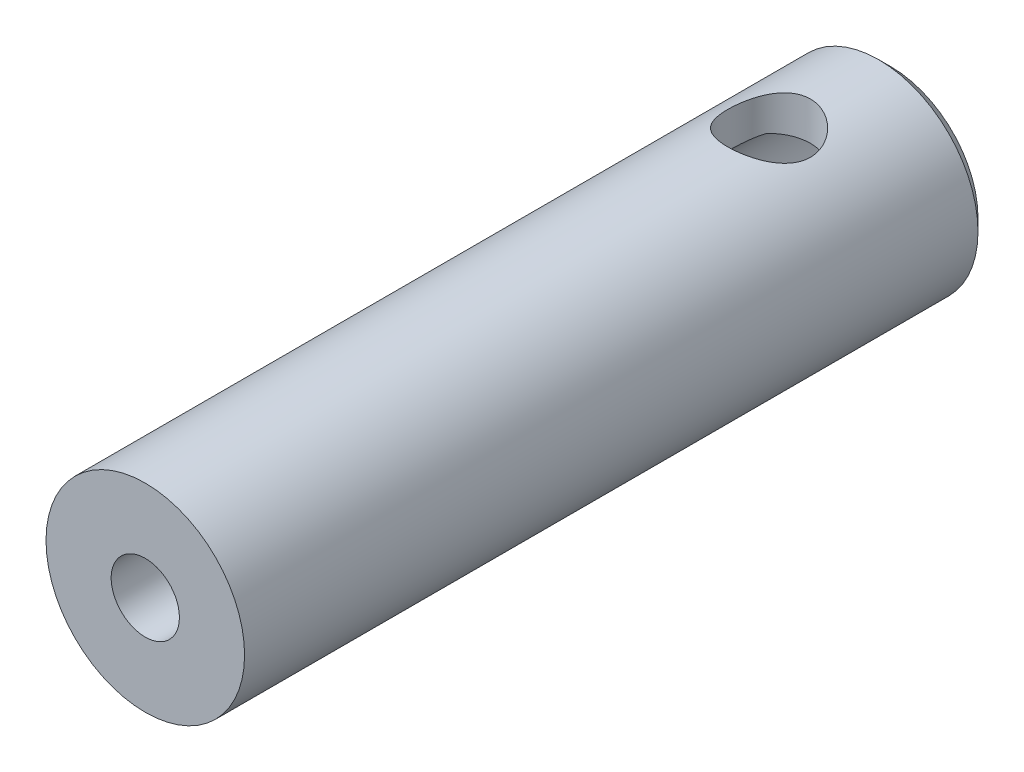
ISO-10303-21;
HEADER;
FILE_DESCRIPTION(('STEP AP214'),'2;1');
FILE_NAME('part.step','',(''),(''),'','','');
FILE_SCHEMA(('AUTOMOTIVE_DESIGN { 1 0 10303 214 1 1 1 1 }'));
ENDSEC;
DATA;
#1=APPLICATION_CONTEXT('core data for automotive mechanical design processes');
#2=APPLICATION_PROTOCOL_DEFINITION('international standard','automotive_design',2000,#1);
#3=PRODUCT_CONTEXT('',#1,'mechanical');
#4=PRODUCT('Part','Part','',(#3));
#5=PRODUCT_RELATED_PRODUCT_CATEGORY('part','',(#4));
#6=PRODUCT_DEFINITION_FORMATION('','',#4);
#7=PRODUCT_DEFINITION_CONTEXT('part definition',#1,'design');
#8=PRODUCT_DEFINITION('design','',#6,#7);
#9=PRODUCT_DEFINITION_SHAPE('','',#8);
#10=(LENGTH_UNIT() NAMED_UNIT(*) SI_UNIT(.MILLI.,.METRE.));
#11=(NAMED_UNIT(*) PLANE_ANGLE_UNIT() SI_UNIT($,.RADIAN.));
#12=(NAMED_UNIT(*) SI_UNIT($,.STERADIAN.) SOLID_ANGLE_UNIT());
#13=UNCERTAINTY_MEASURE_WITH_UNIT(LENGTH_MEASURE(1.E-05),#10,'distance_accuracy_value','');
#14=(GEOMETRIC_REPRESENTATION_CONTEXT(3) GLOBAL_UNCERTAINTY_ASSIGNED_CONTEXT((#13)) GLOBAL_UNIT_ASSIGNED_CONTEXT((#10,
#11,#12)) REPRESENTATION_CONTEXT('',''));
#15=CARTESIAN_POINT('',(0.,0.,0.));
#16=DIRECTION('',(0.,0.,1.));
#17=DIRECTION('',(1.,0.,0.));
#18=AXIS2_PLACEMENT_3D('',#15,#16,#17);
#19=CARTESIAN_POINT('',(1.26095202129185,2.5,14.));
#20=DIRECTION('',(0.,1.,0.));
#21=DIRECTION('',(0.,0.,1.));
#22=AXIS2_PLACEMENT_3D('',#19,#20,#21);
#23=PLANE('',#22);
#24=DIRECTION('',(0.,0.,-1.));
#25=VECTOR('',#24,1.);
#26=CARTESIAN_POINT('',(1.26095202129185,2.5,14.));
#27=LINE('',#26,#25);
#28=CARTESIAN_POINT('',(1.26095202129185,2.5,3.85982457490088));
#29=VERTEX_POINT('',#28);
#30=CARTESIAN_POINT('',(1.26095202129185,2.5,3.));
#31=VERTEX_POINT('',#30);
#32=EDGE_CURVE('E59',#29,#31,#27,.T.);
#33=ORIENTED_EDGE('',*,*,#32,.F.);
#34=CARTESIAN_POINT('',(0.,2.5,5.));
#35=DIRECTION('',(0.,1.,0.));
#36=DIRECTION('',(0.,0.,1.));
#37=AXIS2_PLACEMENT_3D('',#34,#35,#36);
#38=CIRCLE('',#37,1.69999999999999);
#39=CARTESIAN_POINT('',(-1.26095202129185,2.5,3.85982457490088));
#40=VERTEX_POINT('',#39);
#41=EDGE_CURVE('E79',#29,#40,#38,.T.);
#42=ORIENTED_EDGE('',*,*,#41,.T.);
#43=DIRECTION('',(0.,0.,-1.));
#44=VECTOR('',#43,1.);
#45=CARTESIAN_POINT('',(-1.26095202129185,2.5,14.));
#46=LINE('',#45,#44);
#47=CARTESIAN_POINT('',(-1.26095202129185,2.5,3.));
#48=VERTEX_POINT('',#47);
#49=EDGE_CURVE('E85',#40,#48,#46,.T.);
#50=ORIENTED_EDGE('',*,*,#49,.T.);
#51=DIRECTION('',(-1.,0.,0.));
#52=VECTOR('',#51,1.);
#53=CARTESIAN_POINT('',(1.26095202129185,2.5,3.));
#54=LINE('',#53,#52);
#55=EDGE_CURVE('E105',#31,#48,#54,.T.);
#56=ORIENTED_EDGE('',*,*,#55,.F.);
#57=EDGE_LOOP('',(#33,#42,#50,#56));
#58=FACE_BOUND('',#57,.T.);
#59=ADVANCED_FACE('F32',(#58),#23,.F.);
#60=CARTESIAN_POINT('',(-1.26095202129185,2.5,14.));
#61=VERTEX_POINT('',#60);
#62=CARTESIAN_POINT('',(-1.26095202129185,2.5,6.14017542509912));
#63=VERTEX_POINT('',#62);
#64=EDGE_CURVE('E92',#61,#63,#46,.T.);
#65=ORIENTED_EDGE('',*,*,#64,.T.);
#66=CARTESIAN_POINT('',(1.26095202129185,2.5,6.14017542509912));
#67=VERTEX_POINT('',#66);
#68=EDGE_CURVE('E52',#63,#67,#38,.T.);
#69=ORIENTED_EDGE('',*,*,#68,.T.);
#70=CARTESIAN_POINT('',(1.26095202129185,2.5,14.));
#71=VERTEX_POINT('',#70);
#72=EDGE_CURVE('E100',#71,#67,#27,.T.);
#73=ORIENTED_EDGE('',*,*,#72,.F.);
#74=DIRECTION('',(1.,0.,0.));
#75=VECTOR('',#74,1.);
#76=CARTESIAN_POINT('',(1.26095202129185,2.5,14.));
#77=LINE('',#76,#75);
#78=EDGE_CURVE('E93',#61,#71,#77,.T.);
#79=ORIENTED_EDGE('',*,*,#78,.F.);
#80=EDGE_LOOP('',(#65,#69,#73,#79));
#81=FACE_BOUND('',#80,.T.);
#82=ADVANCED_FACE('F125',(#81),#23,.F.);
#83=CARTESIAN_POINT('',(0.,0.,30.6));
#84=DIRECTION('',(0.,0.,-1.));
#85=DIRECTION('',(-1.,0.,0.));
#86=AXIS2_PLACEMENT_3D('',#83,#84,#85);
#87=CYLINDRICAL_SURFACE('',#86,4.075);
#88=CARTESIAN_POINT('',(0.,4.075,6.69999999999999));
#89=CARTESIAN_POINT('',(-0.0910534279162395,4.07499260432126,6.69999016654546));
#90=CARTESIAN_POINT('',(-0.182249549872274,4.07191284590084,6.69264128888376));
#91=CARTESIAN_POINT('',(-0.362056668819456,4.05989082699971,6.66350693807894));
#92=CARTESIAN_POINT('',(-0.450660299103877,4.05093328962757,6.64168384350974));
#93=CARTESIAN_POINT('',(-0.622386422636992,4.02811806766699,6.58454783682235));
#94=CARTESIAN_POINT('',(-0.70552639330874,4.0142770107511,6.54928066744866));
#95=CARTESIAN_POINT('',(-0.864629267297827,3.98304198973891,6.4664466407294));
#96=CARTESIAN_POINT('',(-0.940594325358632,3.96564909731044,6.41888349220596));
#97=CARTESIAN_POINT('',(-1.08713350591362,3.92807192381843,6.31028059042402));
#98=CARTESIAN_POINT('',(-1.15729932171407,3.90779608252746,6.24872186467343));
#99=CARTESIAN_POINT('',(-1.28666231760976,3.86713488276138,6.11497259773166));
#100=CARTESIAN_POINT('',(-1.34585370934304,3.84674947229451,6.04277648176715));
#101=CARTESIAN_POINT('',(-1.45447425332522,3.80705165053085,5.88548284308962));
#102=CARTESIAN_POINT('',(-1.50327745916567,3.78784184354422,5.79992445517416));
#103=CARTESIAN_POINT('',(-1.58561728606681,3.75412270424878,5.62089547195574));
#104=CARTESIAN_POINT('',(-1.61916179090438,3.73961094569958,5.52742899223453));
#105=CARTESIAN_POINT('',(-1.6683448945238,3.71792220755995,5.33993658474451));
#106=CARTESIAN_POINT('',(-1.68476941918664,3.71042508504694,5.24615528508344));
#107=CARTESIAN_POINT('',(-1.70169818392718,3.70269417493778,5.05689122174614));
#108=CARTESIAN_POINT('',(-1.70221123488145,3.70245636754358,4.96140942901891));
#109=CARTESIAN_POINT('',(-1.68789435208567,3.70900008143274,4.77929199480359));
#110=CARTESIAN_POINT('',(-1.67424100385821,3.71524333975978,4.6925406284622));
#111=CARTESIAN_POINT('',(-1.63395282295761,3.73313592174508,4.52269596424905));
#112=CARTESIAN_POINT('',(-1.60731549701446,3.74478628369088,4.43960337230232));
#113=CARTESIAN_POINT('',(-1.54129596328105,3.77244366379775,4.27733409752812));
#114=CARTESIAN_POINT('',(-1.50165432564395,3.78853820935987,4.19827855328006));
#115=CARTESIAN_POINT('',(-1.41093492637839,3.82325026942016,4.04763369118805));
#116=CARTESIAN_POINT('',(-1.35985264853085,3.8418687791102,3.97604733822809));
#117=CARTESIAN_POINT('',(-1.24262055652557,3.88145027955752,3.83598833236373));
#118=CARTESIAN_POINT('',(-1.17556074225042,3.90247824557875,3.76829356788834));
#119=CARTESIAN_POINT('',(-1.03083250697166,3.94317844002384,3.64484949164498));
#120=CARTESIAN_POINT('',(-0.953161595807413,3.96285034857946,3.58910299174967));
#121=CARTESIAN_POINT('',(-0.787047104901489,3.99919568056005,3.48999333024618));
#122=CARTESIAN_POINT('',(-0.698395478119116,4.01578899089647,3.44694731408156));
#123=CARTESIAN_POINT('',(-0.514240002465009,4.04349231807901,3.37665296205483));
#124=CARTESIAN_POINT('',(-0.418739983134088,4.05460537245267,3.34939587343744));
#125=CARTESIAN_POINT('',(-0.230098689883129,4.06952818961072,3.31308295550875));
#126=CARTESIAN_POINT('',(-0.137191403769883,4.07375610842914,3.30298323585278));
#127=CARTESIAN_POINT('',(0.0490790617836757,4.07576757215171,3.29815868845004));
#128=CARTESIAN_POINT('',(0.142442102194162,4.07355297301933,3.3034294327742));
#129=CARTESIAN_POINT('',(0.322080543031627,4.06319935163477,3.32844952224077));
#130=CARTESIAN_POINT('',(0.408477418688553,4.05536070541397,3.34746513383237));
#131=CARTESIAN_POINT('',(0.576759971311243,4.03486841911517,3.39841328174211));
#132=CARTESIAN_POINT('',(0.658645077207279,4.02221417110583,3.43034744895702));
#133=CARTESIAN_POINT('',(0.818452005377538,3.99281488074206,3.50726920959317));
#134=CARTESIAN_POINT('',(0.896171604715423,3.97595493985345,3.55263158992438));
#135=CARTESIAN_POINT('',(1.04317388541862,3.93994292948317,3.65471034369173));
#136=CARTESIAN_POINT('',(1.11245302097279,3.92078990333713,3.71143146262459));
#137=CARTESIAN_POINT('',(1.24582425620624,3.88055944974031,3.83937094187287));
#138=CARTESIAN_POINT('',(1.30918929155551,3.85944245187667,3.91133673509275));
#139=CARTESIAN_POINT('',(1.42314684852216,3.8188932549299,4.06521590502212));
#140=CARTESIAN_POINT('',(1.47373644300583,3.79946144262817,4.1471315551063));
#141=CARTESIAN_POINT('',(1.56126065330767,3.76435329429814,4.32029076047103));
#142=CARTESIAN_POINT('',(1.59798822780163,3.74873504348648,4.41165161437387));
#143=CARTESIAN_POINT('',(1.65522549985618,3.72382144081087,4.60011740509648));
#144=CARTESIAN_POINT('',(1.67574861444973,3.71452085891164,4.69721751814073));
#145=CARTESIAN_POINT('',(1.69865947409782,3.70409568472623,4.88633590120618));
#146=CARTESIAN_POINT('',(1.70232387216982,3.70239582374902,4.97816850494121));
#147=CARTESIAN_POINT('',(1.69482319478967,3.70583553098445,5.1610859621772));
#148=CARTESIAN_POINT('',(1.68366040936731,3.71097404302386,5.25217092896323));
#149=CARTESIAN_POINT('',(1.64789549873334,3.72698517648098,5.42661662756391));
#150=CARTESIAN_POINT('',(1.62394651128868,3.73757830393934,5.51013937068203));
#151=CARTESIAN_POINT('',(1.56392843306002,3.76308522257692,5.67199993664729));
#152=CARTESIAN_POINT('',(1.52785593489783,3.77800022828078,5.75033629441555));
#153=CARTESIAN_POINT('',(1.44211375643517,3.81158384925509,5.90474884747401));
#154=CARTESIAN_POINT('',(1.3917561527253,3.83042440065822,5.98040495898851));
#155=CARTESIAN_POINT('',(1.27983533233093,3.86925734177807,6.12259264936897));
#156=CARTESIAN_POINT('',(1.21826821487897,3.88925013079831,6.18912103772756));
#157=CARTESIAN_POINT('',(1.08033387195235,3.92989004049958,6.31616769472346));
#158=CARTESIAN_POINT('',(1.00321382092644,3.95047818719304,6.37589131633013));
#159=CARTESIAN_POINT('',(0.839283350923429,3.98852075247719,6.481590821251));
#160=CARTESIAN_POINT('',(0.752468542464769,4.00597374216198,6.52756044224544));
#161=CARTESIAN_POINT('',(0.572952091897065,4.03552874885844,6.60345578139557));
#162=CARTESIAN_POINT('',(0.480370816468083,4.04771408619487,6.63363304202708));
#163=CARTESIAN_POINT('',(0.290998633115147,4.06570008796472,6.67770950583355));
#164=CARTESIAN_POINT('',(0.194221894391157,4.07152073033666,6.69165965262609));
#165=CARTESIAN_POINT('',(0.0647377695559406,4.07461677186881,6.69907900098689));
#166=CARTESIAN_POINT('',(0.0323779063196759,4.0750026298471,6.70000349670161));
#167=CARTESIAN_POINT('',(0.,4.075,6.69999999999999));
#168=B_SPLINE_CURVE_WITH_KNOTS('',3,(#88,#89,#90,#91,#92,#93,#94,#95,#96,#97,#98,#99,#100,#101,
#102,#103,#104,#105,#106,#107,#108,#109,#110,#111,#112,#113,#114,#115,#116,#117,#118,#119,#120,
#121,#122,#123,#124,#125,#126,#127,#128,#129,#130,#131,#132,#133,#134,#135,#136,#137,#138,#139,
#140,#141,#142,#143,#144,#145,#146,#147,#148,#149,#150,#151,#152,#153,#154,#155,#156,#157,#158,
#159,#160,#161,#162,#163,#164,#165,#166,#167),.UNSPECIFIED.,.T.,.F.,(4,2,2,2,2,2,2,2,2,2,2,2,2,
2,2,2,2,2,2,2,2,2,2,2,2,2,2,2,2,2,2,2,2,2,2,2,2,2,2,4),(0.,0.273067961935496,0.546848479019654,
0.819705668815404,1.09248065284021,1.37779406507045,1.66325753785151,1.96280906918323,
2.26220565368413,2.5471551361555,2.83194682685858,3.09484281323472,3.35778930255172,
3.62633766076553,3.89499221649893,4.18641223089118,4.47790075217045,4.77614882786838,
5.07423140803913,5.35342582142094,5.63253981231679,5.89776085484546,6.16301539052991,
6.43651244967183,6.71012401072802,7.00333537491354,7.29661385942443,7.59411398935441,
7.89136753487988,8.16569461478568,8.43997933033143,8.701432681828,8.9629595777377,
9.24023325348693,9.51760360198916,9.81524629487308,10.1130243016325,10.4059026353956,
10.6978590000612,10.7949598900858),.UNSPECIFIED.);
#169=CARTESIAN_POINT('',(0.,4.075,6.69999999999999));
#170=VERTEX_POINT('',#169);
#171=EDGE_CURVE('E87',#170,#170,#168,.T.);
#172=ORIENTED_EDGE('',*,*,#171,.T.);
#173=EDGE_LOOP('',(#172));
#174=FACE_BOUND('',#173,.T.);
#175=CARTESIAN_POINT('',(0.,0.,0.5));
#176=DIRECTION('',(0.,0.,1.));
#177=DIRECTION('',(1.,0.,0.));
#178=AXIS2_PLACEMENT_3D('',#175,#176,#177);
#179=CIRCLE('',#178,4.075);
#180=CARTESIAN_POINT('',(4.075,0.,0.5));
#181=VERTEX_POINT('',#180);
#182=EDGE_CURVE('E107',#181,#181,#179,.T.);
#183=ORIENTED_EDGE('',*,*,#182,.T.);
#184=EDGE_LOOP('',(#183));
#185=FACE_BOUND('',#184,.T.);
#186=CARTESIAN_POINT('',(0.,0.,30.6));
#187=DIRECTION('',(0.,0.,1.));
#188=DIRECTION('',(1.,0.,0.));
#189=AXIS2_PLACEMENT_3D('',#186,#187,#188);
#190=CIRCLE('',#189,4.075);
#191=CARTESIAN_POINT('',(4.075,0.,30.6));
#192=VERTEX_POINT('',#191);
#193=EDGE_CURVE('E102',#192,#192,#190,.T.);
#194=ORIENTED_EDGE('',*,*,#193,.F.);
#195=EDGE_LOOP('',(#194));
#196=FACE_BOUND('',#195,.T.);
#197=ADVANCED_FACE('F121',(#174,#185,#196),#87,.T.);
#198=CARTESIAN_POINT('',(0.,0.,30.6));
#199=DIRECTION('',(0.,0.,1.));
#200=DIRECTION('',(1.,0.,0.));
#201=AXIS2_PLACEMENT_3D('',#198,#199,#200);
#202=PLANE('',#201);
#203=CARTESIAN_POINT('',(0.,0.,30.6));
#204=DIRECTION('',(0.,0.,1.));
#205=DIRECTION('',(1.,0.,0.));
#206=AXIS2_PLACEMENT_3D('',#203,#204,#205);
#207=CIRCLE('',#206,1.4);
#208=CARTESIAN_POINT('',(1.4,0.,30.6));
#209=VERTEX_POINT('',#208);
#210=EDGE_CURVE('E161',#209,#209,#207,.T.);
#211=ORIENTED_EDGE('',*,*,#210,.F.);
#212=EDGE_LOOP('',(#211));
#213=FACE_BOUND('',#212,.T.);
#214=ORIENTED_EDGE('',*,*,#193,.T.);
#215=EDGE_LOOP('',(#214));
#216=FACE_BOUND('',#215,.T.);
#217=ADVANCED_FACE('F124',(#213,#216),#202,.T.);
#218=CARTESIAN_POINT('',(0.,0.,0.));
#219=DIRECTION('',(0.,0.,1.));
#220=DIRECTION('',(1.,0.,0.));
#221=AXIS2_PLACEMENT_3D('',#218,#219,#220);
#222=PLANE('',#221);
#223=CARTESIAN_POINT('',(0.,0.,0.));
#224=DIRECTION('',(0.,0.,1.));
#225=DIRECTION('',(1.,0.,0.));
#226=AXIS2_PLACEMENT_3D('',#223,#224,#225);
#227=CIRCLE('',#226,3.575);
#228=CARTESIAN_POINT('',(3.575,0.,0.));
#229=VERTEX_POINT('',#228);
#230=EDGE_CURVE('E82',#229,#229,#227,.F.);
#231=ORIENTED_EDGE('',*,*,#230,.T.);
#232=EDGE_LOOP('',(#231));
#233=FACE_BOUND('',#232,.T.);
#234=CARTESIAN_POINT('',(0.,0.,0.));
#235=DIRECTION('',(0.,0.,-1.));
#236=DIRECTION('',(-1.,0.,0.));
#237=AXIS2_PLACEMENT_3D('',#234,#235,#236);
#238=CIRCLE('',#237,2.8);
#239=CARTESIAN_POINT('',(-2.8,0.,0.));
#240=VERTEX_POINT('',#239);
#241=EDGE_CURVE('E155',#240,#240,#238,.T.);
#242=ORIENTED_EDGE('',*,*,#241,.F.);
#243=EDGE_LOOP('',(#242));
#244=FACE_BOUND('',#243,.T.);
#245=ADVANCED_FACE('F112',(#233,#244),#222,.F.);
#246=CARTESIAN_POINT('',(0.,0.,14.));
#247=DIRECTION('',(0.,0.,-1.));
#248=DIRECTION('',(-1.,0.,0.));
#249=AXIS2_PLACEMENT_3D('',#246,#247,#248);
#250=CYLINDRICAL_SURFACE('',#249,2.8);
#251=ORIENTED_EDGE('',*,*,#241,.T.);
#252=EDGE_LOOP('',(#251));
#253=FACE_BOUND('',#252,.T.);
#254=ORIENTED_EDGE('',*,*,#72,.T.);
#255=CARTESIAN_POINT('',(0.,2.8,6.69999999999999));
#256=CARTESIAN_POINT('',(0.0867923790096469,2.79999451557529,6.69999397505488));
#257=CARTESIAN_POINT('',(0.173716595999157,2.79592066232847,6.69330668431786));
#258=CARTESIAN_POINT('',(0.344934496289961,2.78000986148793,6.66690181855674));
#259=CARTESIAN_POINT('',(0.429221625402907,2.76815496759414,6.64715412002183));
#260=CARTESIAN_POINT('',(0.592330632544928,2.7378809150248,6.59575062154612));
#261=CARTESIAN_POINT('',(0.671177351817991,2.71949432868323,6.5641538678972));
#262=CARTESIAN_POINT('',(0.822194909010507,2.67771229019546,6.49032469431543));
#263=CARTESIAN_POINT('',(0.894367132324886,2.65431788085708,6.44809448832537));
#264=CARTESIAN_POINT('',(1.03631433953641,2.60234461475156,6.3505678060868));
#265=CARTESIAN_POINT('',(1.10547052376289,2.57350453002685,6.29451256515499));
#266=CARTESIAN_POINT('',(1.23400325224467,2.51440884234026,6.17264419488545));
#267=CARTESIAN_POINT('',(1.29336687078338,2.48415143511916,6.10681838305033));
#268=CARTESIAN_POINT('',(1.40823759213748,2.42108983100889,5.95751193501877));
#269=CARTESIAN_POINT('',(1.46231205257491,2.38844625687043,5.87285160332377));
#270=CARTESIAN_POINT('',(1.55527495920521,2.32898615859552,5.69372707266815));
#271=CARTESIAN_POINT('',(1.59418837588441,2.30216008553566,5.59927932141534));
#272=CARTESIAN_POINT('',(1.64732648291046,2.26431144925895,5.42698755201206));
#273=CARTESIAN_POINT('',(1.66527284415021,2.25102316174489,5.3507915682136));
#274=CARTESIAN_POINT('',(1.69051038317085,2.2321363163772,5.19576032669432));
#275=CARTESIAN_POINT('',(1.69781530507956,2.22652784009896,5.11692860813524));
#276=CARTESIAN_POINT('',(1.70134350968917,2.22383387104738,4.95869797437812));
#277=CARTESIAN_POINT('',(1.69754311643873,2.22676658760613,4.87929820789355));
#278=CARTESIAN_POINT('',(1.67905646234004,2.24073554137711,4.72248665133116));
#279=CARTESIAN_POINT('',(1.66436184957479,2.25177799575728,4.64507643365115));
#280=CARTESIAN_POINT('',(1.62519639660849,2.28019806291905,4.49538429956974));
#281=CARTESIAN_POINT('',(1.60088117749191,2.29747446285908,4.42304134342562));
#282=CARTESIAN_POINT('',(1.54338373916694,2.33648692467598,4.28328244542408));
#283=CARTESIAN_POINT('',(1.51019830501119,2.35822460284734,4.21586830128483));
#284=CARTESIAN_POINT('',(1.42908695886539,2.40839487254795,4.07510292592938));
#285=CARTESIAN_POINT('',(1.37958766776812,2.43733005368179,4.00283718021966));
#286=CARTESIAN_POINT('',(1.27029399301876,2.49603869456807,3.86687476405557));
#287=CARTESIAN_POINT('',(1.21048953295054,2.52581295070822,3.80318659039453));
#288=CARTESIAN_POINT('',(1.07189642441943,2.58797423181749,3.6767189138424));
#289=CARTESIAN_POINT('',(0.99161033925725,2.62010587161609,3.61543664660648));
#290=CARTESIAN_POINT('',(0.819952493151537,2.6787845899605,3.50737025550734));
#291=CARTESIAN_POINT('',(0.72858631055062,2.70533446042827,3.46057887793919));
#292=CARTESIAN_POINT('',(0.542868662296561,2.74842010228645,3.38609864844368));
#293=CARTESIAN_POINT('',(0.449037696876518,2.76546718541763,3.3574201481484));
#294=CARTESIAN_POINT('',(0.256662941472118,2.78988939278999,3.31662334496725));
#295=CARTESIAN_POINT('',(0.158125244512409,2.79727668811314,3.30448420210912));
#296=CARTESIAN_POINT('',(-0.0259215301712412,2.80117884910645,3.29805981187145));
#297=CARTESIAN_POINT('',(-0.111331838953446,2.79906586336498,3.30152148495674));
#298=CARTESIAN_POINT('',(-0.280142230484364,2.78723416918719,3.32109075919178));
#299=CARTESIAN_POINT('',(-0.363542377930744,2.77751570587337,3.33719795277983));
#300=CARTESIAN_POINT('',(-0.523704965604631,2.75175159267244,3.38060807223233));
#301=CARTESIAN_POINT('',(-0.600588450958491,2.73589275817166,3.40758130704503));
#302=CARTESIAN_POINT('',(-0.748704623929292,2.69912409561423,3.47161619996232));
#303=CARTESIAN_POINT('',(-0.819936246924112,2.67821331892677,3.50867975294713));
#304=CARTESIAN_POINT('',(-0.962685341140004,2.6304884736397,3.59609516543401));
#305=CARTESIAN_POINT('',(-1.03347354662207,2.60328787564021,3.64742369381889));
#306=CARTESIAN_POINT('',(-1.16595888118392,2.54671183526516,3.75979844836106));
#307=CARTESIAN_POINT('',(-1.22764534771534,2.51733390173237,3.82085590042952));
#308=CARTESIAN_POINT('',(-1.34875100030788,2.45481392232603,3.96051407279169));
#309=CARTESIAN_POINT('',(-1.40674455202725,2.42169810330617,4.04037009642046));
#310=CARTESIAN_POINT('',(-1.50858447105766,2.35960471858085,4.21009947339707));
#311=CARTESIAN_POINT('',(-1.55244443128873,2.33062319178198,4.29996308935951));
#312=CARTESIAN_POINT('',(-1.61648681595649,2.28651426673801,4.46782548575914));
#313=CARTESIAN_POINT('',(-1.63973279257598,2.26974781281423,4.54421954338138));
#314=CARTESIAN_POINT('',(-1.67535761647067,2.24358527382213,4.70068070792989));
#315=CARTESIAN_POINT('',(-1.68775214407594,2.23417855604331,4.78074233846084));
#316=CARTESIAN_POINT('',(-1.7009844142736,2.22412432782844,4.94273530378859));
#317=CARTESIAN_POINT('',(-1.70177272816791,2.22351428099896,5.02467314773345));
#318=CARTESIAN_POINT('',(-1.69160657251815,2.23125584958215,5.18740449615351));
#319=CARTESIAN_POINT('',(-1.68064624006059,2.23961193935775,5.26819740888035));
#320=CARTESIAN_POINT('',(-1.64862335984465,2.26327233999024,5.42171825605707));
#321=CARTESIAN_POINT('',(-1.62817128145921,2.27815412635314,5.49464349509154));
#322=CARTESIAN_POINT('',(-1.57830836120597,2.31297735818379,5.63605907686564));
#323=CARTESIAN_POINT('',(-1.54889409625711,2.33292073642483,5.70454771291626));
#324=CARTESIAN_POINT('',(-1.4768206702706,2.37930644792882,5.84631548580965));
#325=CARTESIAN_POINT('',(-1.4328283779198,2.40627579904868,5.91874229883683));
#326=CARTESIAN_POINT('',(-1.33498209938639,2.46190919882908,6.05590328397896));
#327=CARTESIAN_POINT('',(-1.28111994323569,2.49057463804922,6.12063100927988));
#328=CARTESIAN_POINT('',(-1.15411424808371,2.55221798659201,6.25209826520228));
#329=CARTESIAN_POINT('',(-1.07924690061424,2.58508251457043,6.31724311148128));
#330=CARTESIAN_POINT('',(-0.918124598454873,2.64660049402965,6.43421233956346));
#331=CARTESIAN_POINT('',(-0.831864827562106,2.67525215361285,6.4860310602229));
#332=CARTESIAN_POINT('',(-0.651669750252535,2.72466744697905,6.57323880171017));
#333=CARTESIAN_POINT('',(-0.557947581856716,2.74559220582331,6.6089673045267));
#334=CARTESIAN_POINT('',(-0.412874850303176,2.76982932033011,6.649868690515));
#335=CARTESIAN_POINT('',(-0.363821563134749,2.77671328350105,6.66138193804041));
#336=CARTESIAN_POINT('',(-0.264615682189275,2.78791308714247,6.68003492326309));
#337=CARTESIAN_POINT('',(-0.214464008717459,2.79223099824936,6.68717818738887));
#338=CARTESIAN_POINT('',(-0.136805723650344,2.79678920348117,6.6947075400577));
#339=CARTESIAN_POINT('',(-0.109498028697674,2.79799154721475,6.69669044252524));
#340=CARTESIAN_POINT('',(-0.0547979400166195,2.79959782990814,6.69933765435597));
#341=CARTESIAN_POINT('',(-0.0274055424109707,2.80000173176073,6.70000190243533));
#342=CARTESIAN_POINT('',(0.,2.8,6.69999999999999));
#343=B_SPLINE_CURVE_WITH_KNOTS('',3,(#255,#256,#257,#258,#259,#260,#261,#262,#263,#264,#265,
#266,#267,#268,#269,#270,#271,#272,#273,#274,#275,#276,#277,#278,#279,#280,#281,#282,#283,#284,
#285,#286,#287,#288,#289,#290,#291,#292,#293,#294,#295,#296,#297,#298,#299,#300,#301,#302,#303,
#304,#305,#306,#307,#308,#309,#310,#311,#312,#313,#314,#315,#316,#317,#318,#319,#320,#321,#322,
#323,#324,#325,#326,#327,#328,#329,#330,#331,#332,#333,#334,#335,#336,#337,#338,#339,#340,#341,
#342),.UNSPECIFIED.,.T.,.F.,(4,2,2,2,2,2,2,2,2,2,2,2,2,2,2,2,2,2,2,2,2,2,2,2,2,2,2,2,2,2,2,2,2,
2,2,2,2,2,2,2,2,2,2,4),(0.,0.260265769911103,0.521133939783651,0.78071906047626,1.0402501787565,
1.31988596205512,1.5998879477747,1.91523359947858,2.23005765369065,2.46725660076057,
2.70414891713305,2.94154664376079,3.17912655682798,3.41301099822202,3.64698032461146,
3.9226781731662,4.1986471454631,4.51500640492495,4.83120704750064,5.12815473013283,
5.42472790472432,5.67995593590866,5.93517574150048,6.18317384394455,6.43121855059168,
6.70486373162473,6.97882698108228,7.28970739366292,7.60028791978447,7.84407372387212,
8.08750667359221,8.33197606036321,8.57656750123091,8.80723806775184,9.03799684890349,
9.30380386610038,9.5698319123028,9.8819544058643,10.1942092756566,10.4995258768898,
10.6518723907037,10.8040958033167,10.8862734462151,10.9684549081915),.UNSPECIFIED.);
#344=EDGE_CURVE('E11',#67,#29,#343,.T.);
#345=ORIENTED_EDGE('',*,*,#344,.T.);
#346=ORIENTED_EDGE('',*,*,#32,.T.);
#347=CARTESIAN_POINT('',(0.,0.,3.));
#348=DIRECTION('',(0.,0.,-1.));
#349=DIRECTION('',(-1.,0.,0.));
#350=AXIS2_PLACEMENT_3D('',#347,#348,#349);
#351=CIRCLE('',#350,2.8);
#352=EDGE_CURVE('E91',#48,#31,#351,.T.);
#353=ORIENTED_EDGE('',*,*,#352,.F.);
#354=ORIENTED_EDGE('',*,*,#49,.F.);
#355=EDGE_CURVE('E36',#40,#63,#343,.T.);
#356=ORIENTED_EDGE('',*,*,#355,.T.);
#357=ORIENTED_EDGE('',*,*,#64,.F.);
#358=CARTESIAN_POINT('',(0.,0.,14.));
#359=DIRECTION('',(0.,0.,-1.));
#360=DIRECTION('',(-1.,0.,0.));
#361=AXIS2_PLACEMENT_3D('',#358,#359,#360);
#362=CIRCLE('',#361,2.8);
#363=EDGE_CURVE('E96',#71,#61,#362,.T.);
#364=ORIENTED_EDGE('',*,*,#363,.F.);
#365=EDGE_LOOP('',(#254,#345,#346,#353,#354,#356,#357,#364));
#366=FACE_BOUND('',#365,.T.);
#367=ADVANCED_FACE('F90',(#253,#366),#250,.F.);
#368=CARTESIAN_POINT('',(0.,0.,14.));
#369=DIRECTION('',(0.,0.,-1.));
#370=DIRECTION('',(-1.,0.,0.));
#371=AXIS2_PLACEMENT_3D('',#368,#369,#370);
#372=PLANE('',#371);
#373=ORIENTED_EDGE('',*,*,#363,.T.);
#374=ORIENTED_EDGE('',*,*,#78,.T.);
#375=EDGE_LOOP('',(#373,#374));
#376=FACE_BOUND('',#375,.T.);
#377=ADVANCED_FACE('F144',(#376),#372,.T.);
#378=CARTESIAN_POINT('',(0.,0.,3.));
#379=DIRECTION('',(0.,0.,-1.));
#380=DIRECTION('',(-1.,0.,0.));
#381=AXIS2_PLACEMENT_3D('',#378,#379,#380);
#382=PLANE('',#381);
#383=ORIENTED_EDGE('',*,*,#55,.T.);
#384=ORIENTED_EDGE('',*,*,#352,.T.);
#385=EDGE_LOOP('',(#383,#384));
#386=FACE_BOUND('',#385,.T.);
#387=ADVANCED_FACE('F118',(#386),#382,.T.);
#388=CARTESIAN_POINT('',(0.,0.,0.5));
#389=DIRECTION('',(0.,0.,1.));
#390=DIRECTION('',(1.,0.,0.));
#391=AXIS2_PLACEMENT_3D('',#388,#389,#390);
#392=CONICAL_SURFACE('',#391,4.075,0.785398163397447);
#393=ORIENTED_EDGE('',*,*,#230,.F.);
#394=EDGE_LOOP('',(#393));
#395=FACE_BOUND('',#394,.T.);
#396=ORIENTED_EDGE('',*,*,#182,.F.);
#397=EDGE_LOOP('',(#396));
#398=FACE_BOUND('',#397,.T.);
#399=ADVANCED_FACE('F34',(#395,#398),#392,.T.);
#400=CARTESIAN_POINT('',(0.,0.,20.6));
#401=DIRECTION('',(0.,0.,1.));
#402=DIRECTION('',(1.,0.,0.));
#403=AXIS2_PLACEMENT_3D('',#400,#401,#402);
#404=CYLINDRICAL_SURFACE('',#403,1.4);
#405=CARTESIAN_POINT('',(0.,0.,20.6));
#406=DIRECTION('',(0.,0.,1.));
#407=DIRECTION('',(1.,0.,0.));
#408=AXIS2_PLACEMENT_3D('',#405,#406,#407);
#409=CIRCLE('',#408,1.4);
#410=CARTESIAN_POINT('',(1.4,0.,20.6));
#411=VERTEX_POINT('',#410);
#412=EDGE_CURVE('E158',#411,#411,#409,.T.);
#413=ORIENTED_EDGE('',*,*,#412,.F.);
#414=EDGE_LOOP('',(#413));
#415=FACE_BOUND('',#414,.T.);
#416=ORIENTED_EDGE('',*,*,#210,.T.);
#417=EDGE_LOOP('',(#416));
#418=FACE_BOUND('',#417,.T.);
#419=ADVANCED_FACE('F117',(#415,#418),#404,.F.);
#420=CARTESIAN_POINT('',(0.,0.,20.6));
#421=DIRECTION('',(0.,0.,1.));
#422=DIRECTION('',(1.,0.,0.));
#423=AXIS2_PLACEMENT_3D('',#420,#421,#422);
#424=PLANE('',#423);
#425=ORIENTED_EDGE('',*,*,#412,.T.);
#426=EDGE_LOOP('',(#425));
#427=FACE_BOUND('',#426,.T.);
#428=ADVANCED_FACE('F174',(#427),#424,.T.);
#429=CARTESIAN_POINT('',(0.,4.075,5.));
#430=DIRECTION('',(0.,1.,0.));
#431=DIRECTION('',(0.,0.,1.));
#432=AXIS2_PLACEMENT_3D('',#429,#430,#431);
#433=CYLINDRICAL_SURFACE('',#432,1.69999999999999);
#434=ORIENTED_EDGE('',*,*,#68,.F.);
#435=ORIENTED_EDGE('',*,*,#355,.F.);
#436=ORIENTED_EDGE('',*,*,#41,.F.);
#437=ORIENTED_EDGE('',*,*,#344,.F.);
#438=EDGE_LOOP('',(#434,#435,#436,#437));
#439=FACE_BOUND('',#438,.T.);
#440=ORIENTED_EDGE('',*,*,#171,.F.);
#441=EDGE_LOOP('',(#440));
#442=FACE_BOUND('',#441,.T.);
#443=ADVANCED_FACE('F77',(#439,#442),#433,.F.);
#444=CLOSED_SHELL('',(#59,#82,#197,#217,#245,#367,#377,#387,#399,#419,#428,#443));
#445=MANIFOLD_SOLID_BREP('B2',#444);
#446=ADVANCED_BREP_SHAPE_REPRESENTATION('',(#18,#445),#14);
#447=SHAPE_DEFINITION_REPRESENTATION(#9,#446);
ENDSEC;
END-ISO-10303-21;
